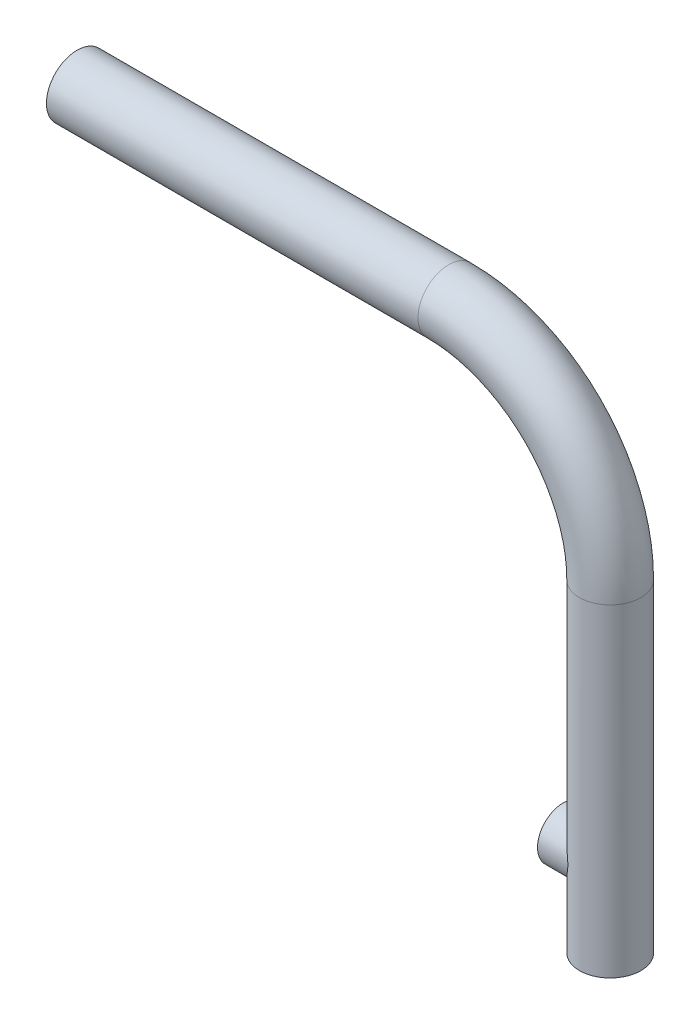
ISO-10303-21;
HEADER;
FILE_DESCRIPTION(('STEP AP214'),'2;1');
FILE_NAME('part.step','',(''),(''),'','','');
FILE_SCHEMA(('AUTOMOTIVE_DESIGN { 1 0 10303 214 1 1 1 1 }'));
ENDSEC;
DATA;
#1=APPLICATION_CONTEXT('core data for automotive mechanical design processes');
#2=APPLICATION_PROTOCOL_DEFINITION('international standard','automotive_design',2000,#1);
#3=PRODUCT_CONTEXT('',#1,'mechanical');
#4=PRODUCT('Part','Part','',(#3));
#5=PRODUCT_RELATED_PRODUCT_CATEGORY('part','',(#4));
#6=PRODUCT_DEFINITION_FORMATION('','',#4);
#7=PRODUCT_DEFINITION_CONTEXT('part definition',#1,'design');
#8=PRODUCT_DEFINITION('design','',#6,#7);
#9=PRODUCT_DEFINITION_SHAPE('','',#8);
#10=(LENGTH_UNIT() NAMED_UNIT(*) SI_UNIT(.MILLI.,.METRE.));
#11=(NAMED_UNIT(*) PLANE_ANGLE_UNIT() SI_UNIT($,.RADIAN.));
#12=(NAMED_UNIT(*) SI_UNIT($,.STERADIAN.) SOLID_ANGLE_UNIT());
#13=UNCERTAINTY_MEASURE_WITH_UNIT(LENGTH_MEASURE(1.E-05),#10,'distance_accuracy_value','');
#14=(GEOMETRIC_REPRESENTATION_CONTEXT(3) GLOBAL_UNCERTAINTY_ASSIGNED_CONTEXT((#13)) GLOBAL_UNIT_ASSIGNED_CONTEXT((#10,
#11,#12)) REPRESENTATION_CONTEXT('',''));
#15=CARTESIAN_POINT('',(0.,0.,0.));
#16=DIRECTION('',(0.,0.,1.));
#17=DIRECTION('',(1.,0.,0.));
#18=AXIS2_PLACEMENT_3D('',#15,#16,#17);
#19=CARTESIAN_POINT('',(80.2564105885616,-44.1229147782417,0.));
#20=DIRECTION('',(0.,-1.,0.));
#21=DIRECTION('',(1.,0.,0.));
#22=AXIS2_PLACEMENT_3D('',#19,#20,#21);
#23=CYLINDRICAL_SURFACE('',#22,19.);
#24=CARTESIAN_POINT('',(80.2564105885616,-244.122914778242,0.));
#25=DIRECTION('',(0.,1.,0.));
#26=DIRECTION('',(-1.,0.,0.));
#27=AXIS2_PLACEMENT_3D('',#24,#25,#26);
#28=CIRCLE('',#27,19.);
#29=CARTESIAN_POINT('',(61.2564105885616,-244.122914778242,0.));
#30=VERTEX_POINT('',#29);
#31=EDGE_CURVE('E64',#30,#30,#28,.T.);
#32=ORIENTED_EDGE('',*,*,#31,.T.);
#33=EDGE_LOOP('',(#32));
#34=FACE_BOUND('',#33,.T.);
#35=CARTESIAN_POINT('',(80.2564105885616,-44.1229147782417,0.));
#36=DIRECTION('',(0.,1.,0.));
#37=DIRECTION('',(-1.,0.,0.));
#38=AXIS2_PLACEMENT_3D('',#35,#36,#37);
#39=CIRCLE('',#38,19.);
#40=CARTESIAN_POINT('',(99.2564105885616,-44.1229147782417,0.));
#41=VERTEX_POINT('',#40);
#42=EDGE_CURVE('E69',#41,#41,#39,.T.);
#43=ORIENTED_EDGE('',*,*,#42,.F.);
#44=EDGE_LOOP('',(#43));
#45=FACE_BOUND('',#44,.T.);
#46=CARTESIAN_POINT('',(70.009459822602,-194.066559594014,-16.));
#47=CARTESIAN_POINT('',(70.0094526559944,-194.344324391861,-15.9999974132716));
#48=CARTESIAN_POINT('',(69.9981066117281,-194.622143252007,-15.9927465313038));
#49=CARTESIAN_POINT('',(69.9533396166383,-195.175349666771,-15.9639407215576));
#50=CARTESIAN_POINT('',(69.9199058030936,-195.450735709895,-15.9423774589891));
#51=CARTESIAN_POINT('',(69.832620377209,-195.99747759059,-15.8854429431641));
#52=CARTESIAN_POINT('',(69.7787176752074,-196.268821563585,-15.8500371327769));
#53=CARTESIAN_POINT('',(69.6529849059693,-196.805305746474,-15.7661998158233));
#54=CARTESIAN_POINT('',(69.5811476577037,-197.07044342473,-15.7177630910479));
#55=CARTESIAN_POINT('',(69.3906608513179,-197.697818231283,-15.5869684987352));
#56=CARTESIAN_POINT('',(69.2647648269802,-198.056641502405,-15.4987850613773));
#57=CARTESIAN_POINT('',(68.9906199837817,-198.75941922518,-15.300671531122));
#58=CARTESIAN_POINT('',(68.842359365878,-199.103365704194,-15.1907299495218));
#59=CARTESIAN_POINT('',(68.5293100555573,-199.777446504139,-14.9503897322486));
#60=CARTESIAN_POINT('',(68.3644766166108,-200.107539824882,-14.8199351460287));
#61=CARTESIAN_POINT('',(68.0236970562892,-200.753447102317,-14.5399249153233));
#62=CARTESIAN_POINT('',(67.8477515267534,-201.069261817965,-14.3903702876888));
#63=CARTESIAN_POINT('',(67.4041218832953,-201.83307569172,-13.9979573477446));
#64=CARTESIAN_POINT('',(67.1322999131043,-202.273185780088,-13.7443554862661));
#65=CARTESIAN_POINT('',(66.5832892170915,-203.125264134734,-13.1983309956678));
#66=CARTESIAN_POINT('',(66.3060981213371,-203.537219592702,-12.9058908736837));
#67=CARTESIAN_POINT('',(65.7545058367255,-204.332380156573,-12.2828235712926));
#68=CARTESIAN_POINT('',(65.4801022134147,-204.715612626916,-11.9522335192349));
#69=CARTESIAN_POINT('',(64.9406543285844,-205.452305268418,-11.2526721267967));
#70=CARTESIAN_POINT('',(64.6756064271122,-205.80577709413,-10.8837159386695));
#71=CARTESIAN_POINT('',(64.2167313006028,-206.407567518139,-10.191271750749));
#72=CARTESIAN_POINT('',(64.0198858387309,-206.662108341304,-9.87517494273733));
#73=CARTESIAN_POINT('',(63.6388310518982,-207.149643373913,-9.21953195567225));
#74=CARTESIAN_POINT('',(63.4546212653549,-207.382638370535,-8.87998663410557));
#75=CARTESIAN_POINT('',(63.1021999632342,-207.824636992283,-8.17844435309756));
#76=CARTESIAN_POINT('',(62.9339675856759,-208.033671978349,-7.8164777196354));
#77=CARTESIAN_POINT('',(62.6164278761091,-208.42560494244,-7.07072443978614));
#78=CARTESIAN_POINT('',(62.4671170308675,-208.608507773327,-6.68694186327398));
#79=CARTESIAN_POINT('',(62.2149285324614,-208.915847763382,-5.96852668943652));
#80=CARTESIAN_POINT('',(62.1085023792318,-209.044910547347,-5.63711326826689));
#81=CARTESIAN_POINT('',(61.9124223486733,-209.281891861819,-4.96201375062467));
#82=CARTESIAN_POINT('',(61.8227652371479,-209.389814469762,-4.61833003594706));
#83=CARTESIAN_POINT('',(61.6618576400204,-209.583010770158,-3.92055342288623));
#84=CARTESIAN_POINT('',(61.5906006463245,-209.668292470966,-3.56646425438804));
#85=CARTESIAN_POINT('',(61.4678562412792,-209.814936833805,-2.84996743837542));
#86=CARTESIAN_POINT('',(61.4163690551863,-209.876299223299,-2.48755969612929));
#87=CARTESIAN_POINT('',(61.3340735946626,-209.974279384822,-1.75540748526202));
#88=CARTESIAN_POINT('',(61.3033584695978,-210.010785698193,-1.38563752366775));
#89=CARTESIAN_POINT('',(61.2636659628452,-210.057948257497,-0.643280762374963));
#90=CARTESIAN_POINT('',(61.2546886265538,-210.068604449447,-0.270693956795509));
#91=CARTESIAN_POINT('',(61.2586773716293,-210.063867761667,0.474178855467361));
#92=CARTESIAN_POINT('',(61.2716425909903,-210.048475905227,0.846464873392307));
#93=CARTESIAN_POINT('',(61.3192189015208,-209.991931264095,1.58766200894079));
#94=CARTESIAN_POINT('',(61.3538291778484,-209.950779449153,1.95657325307938));
#95=CARTESIAN_POINT('',(61.4407242001684,-209.847268776043,2.66218729119098));
#96=CARTESIAN_POINT('',(61.4915828320492,-209.786619179965,2.99932009383728));
#97=CARTESIAN_POINT('',(61.6103811806391,-209.644618701966,3.66609558882488));
#98=CARTESIAN_POINT('',(61.6783199029461,-209.5632690252,3.99573871599689));
#99=CARTESIAN_POINT('',(61.8301228440137,-209.380952431585,4.64578759618012));
#100=CARTESIAN_POINT('',(61.913987615864,-209.279984833431,4.96619302793375));
#101=CARTESIAN_POINT('',(62.096324828296,-209.059642656615,5.59632827158694));
#102=CARTESIAN_POINT('',(62.1947981806717,-208.940266928992,5.90605741563841));
#103=CARTESIAN_POINT('',(62.4135860113287,-208.673839894684,6.53870466215178));
#104=CARTESIAN_POINT('',(62.5350307061248,-208.525319909599,6.86061247174463));
#105=CARTESIAN_POINT('',(62.7915312750707,-208.209771871296,7.48955002903106));
#106=CARTESIAN_POINT('',(62.9265875346631,-208.042743293951,7.79657935504148));
#107=CARTESIAN_POINT('',(63.2085564121969,-207.691547819866,8.39524908960755));
#108=CARTESIAN_POINT('',(63.3554760731088,-207.507370732454,8.68688018422615));
#109=CARTESIAN_POINT('',(63.6593018145617,-207.123274834789,9.25416481867157));
#110=CARTESIAN_POINT('',(63.8162098704018,-206.923352908981,9.5298151774344));
#111=CARTESIAN_POINT('',(64.2166582636147,-206.408009457074,10.1951868281285));
#112=CARTESIAN_POINT('',(64.4651847491201,-206.083742996398,10.5751081651732));
#113=CARTESIAN_POINT('',(64.9746961210211,-205.405908883411,11.2989033730554));
#114=CARTESIAN_POINT('',(65.2356866853815,-205.052327821905,11.642760582594));
#115=CARTESIAN_POINT('',(65.764665292189,-204.317218530551,12.2949536390451));
#116=CARTESIAN_POINT('',(66.0326651276411,-203.935640951345,12.6032241714526));
#117=CARTESIAN_POINT('',(66.5687206229712,-203.14604618607,13.183434640534));
#118=CARTESIAN_POINT('',(66.8367762326857,-202.738038056249,13.4553869246455));
#119=CARTESIAN_POINT('',(67.2996652754574,-201.999904385659,13.899590876647));
#120=CARTESIAN_POINT('',(67.4961521959707,-201.6755979274,14.0798308691496));
#121=CARTESIAN_POINT('',(67.8808359576272,-201.011218446468,14.4191146943914));
#122=CARTESIAN_POINT('',(68.0690320259053,-200.671143959953,14.578156553849));
#123=CARTESIAN_POINT('',(68.4316070427296,-199.975363656054,14.8737552808811));
#124=CARTESIAN_POINT('',(68.6060177311384,-199.619696862292,15.0103646292503));
#125=CARTESIAN_POINT('',(68.9350490342606,-198.891355683295,15.26005821871));
#126=CARTESIAN_POINT('',(69.089680229632,-198.518690536966,15.3731550577817));
#127=CARTESIAN_POINT('',(69.321705587485,-197.890237331243,15.5384959915012));
#128=CARTESIAN_POINT('',(69.4071535193275,-197.639364519259,15.5981623733734));
#129=CARTESIAN_POINT('',(69.5638304968046,-197.13082844317,15.7059787542427));
#130=CARTESIAN_POINT('',(69.6350645642333,-196.87316761384,15.754132821765));
#131=CARTESIAN_POINT('',(69.7606557142116,-196.352293942971,15.8380821933515));
#132=CARTESIAN_POINT('',(69.8150461102697,-196.089093174422,15.8739019082876));
#133=CARTESIAN_POINT('',(69.9047950505877,-195.558000677199,15.9325751375315));
#134=CARTESIAN_POINT('',(69.9401542796204,-195.290109117665,15.9554291183694));
#135=CARTESIAN_POINT('',(69.9903020744348,-194.749248842477,15.9877432145455));
#136=CARTESIAN_POINT('',(70.0049119779773,-194.476256296058,15.9970870126134));
#137=CARTESIAN_POINT('',(70.0121893984186,-193.929864998533,16.0017484326013));
#138=CARTESIAN_POINT('',(70.0048576915314,-193.656466262139,15.9970665506987));
#139=CARTESIAN_POINT('',(69.968639530436,-193.11143182339,15.9737978642688));
#140=CARTESIAN_POINT('',(69.939730639598,-192.83979825329,15.9551965858664));
#141=CARTESIAN_POINT('',(69.8618439697079,-192.300707633455,15.9045627610877));
#142=CARTESIAN_POINT('',(69.812862878019,-192.033251280679,15.8725279976816));
#143=CARTESIAN_POINT('',(69.6839988962992,-191.444339197193,15.7870628562369));
#144=CARTESIAN_POINT('',(69.5996351175079,-191.124331368014,15.7304341918573));
#145=CARTESIAN_POINT('',(69.4089209357642,-190.494693975531,15.5995288061324));
#146=CARTESIAN_POINT('',(69.3025636615142,-190.185067690891,15.5252465683004));
#147=CARTESIAN_POINT('',(69.0722489050903,-189.57598925959,15.3601638187153));
#148=CARTESIAN_POINT('',(68.9482424767407,-189.276568378064,15.2693171652119));
#149=CARTESIAN_POINT('',(68.6870120271868,-188.688804900612,15.0723529128142));
#150=CARTESIAN_POINT('',(68.5497874519644,-188.400462769746,14.9662346737429));
#151=CARTESIAN_POINT('',(68.1790511174416,-187.66201409987,14.6704694093156));
#152=CARTESIAN_POINT('',(67.9378073559835,-187.220368156043,14.4693189204878));
#153=CARTESIAN_POINT('',(67.4414904295106,-186.363043205597,14.0316635576138));
#154=CARTESIAN_POINT('',(67.186409557972,-185.947378952569,13.7951388504856));
#155=CARTESIAN_POINT('',(66.6705374062404,-185.140634488356,13.2874084859563));
#156=CARTESIAN_POINT('',(66.4097393541105,-184.749585820882,13.0161596285378));
#157=CARTESIAN_POINT('',(65.8895144786231,-183.992675152031,12.4395787757339));
#158=CARTESIAN_POINT('',(65.6300873840334,-183.626807982238,12.1342538082821));
#159=CARTESIAN_POINT('',(65.1096667887173,-182.90919144038,11.4785535846209));
#160=CARTESIAN_POINT('',(64.8489149099035,-182.558332816372,11.1270072249177));
#161=CARTESIAN_POINT('',(64.3408373749021,-181.886505623853,10.3872986022929));
#162=CARTESIAN_POINT('',(64.0935142621657,-181.565542709505,9.99912944074695));
#163=CARTESIAN_POINT('',(63.6187924467247,-180.957544268041,9.18748707196169));
#164=CARTESIAN_POINT('',(63.3913412994135,-180.670418694459,8.76411292469729));
#165=CARTESIAN_POINT('',(63.0692030935064,-180.267772057135,8.1030872161576));
#166=CARTESIAN_POINT('',(62.9650122496828,-180.138249008801,7.87845672812986));
#167=CARTESIAN_POINT('',(62.7636538975671,-179.88904442821,7.4206464760882));
#168=CARTESIAN_POINT('',(62.6664879980322,-179.769365149382,7.18746477210308));
#169=CARTESIAN_POINT('',(62.4473482192124,-179.500478454274,6.6299082466765));
#170=CARTESIAN_POINT('',(62.3285848087609,-179.355584897766,6.30216465690627));
#171=CARTESIAN_POINT('',(62.1072262672875,-179.086615513067,5.63304971821279));
#172=CARTESIAN_POINT('',(62.0046267440221,-178.962534028979,5.29168210308107));
#173=CARTESIAN_POINT('',(61.8173973231338,-178.736811279047,4.5969683362017));
#174=CARTESIAN_POINT('',(61.7327585302797,-178.635158903966,4.24362821498651));
#175=CARTESIAN_POINT('',(61.5830221753146,-178.455733884517,3.52684024959074));
#176=CARTESIAN_POINT('',(61.5179251985831,-178.377961955492,3.16339210297826));
#177=CARTESIAN_POINT('',(61.4083360591832,-178.247229870777,2.42682412778136));
#178=CARTESIAN_POINT('',(61.3639614594914,-178.194411261956,2.0536615001948));
#179=CARTESIAN_POINT('',(61.2973639382246,-178.115198805636,1.30256662997782));
#180=CARTESIAN_POINT('',(61.2751409533951,-178.08880488268,0.924634400970232));
#181=CARTESIAN_POINT('',(61.253370442362,-178.062948018694,0.16724949974826));
#182=CARTESIAN_POINT('',(61.2538196313038,-178.063481176337,-0.212202944244198));
#183=CARTESIAN_POINT('',(61.2773765433796,-178.091460486605,-0.969390122756827));
#184=CARTESIAN_POINT('',(61.300483024361,-178.118905163845,-1.34712495030226));
#185=CARTESIAN_POINT('',(61.3659044873758,-178.196725971376,-2.06586036144871));
#186=CARTESIAN_POINT('',(61.4064252983877,-178.244961195803,-2.40726072967014));
#187=CARTESIAN_POINT('',(61.5052098526489,-178.362784234435,-3.08371454189126));
#188=CARTESIAN_POINT('',(61.5634723818538,-178.432370587611,-3.41876841850782));
#189=CARTESIAN_POINT('',(61.6967041652384,-178.59191493645,-4.08059609367622));
#190=CARTESIAN_POINT('',(61.7716744310161,-178.68187416563,-4.40736938953163));
#191=CARTESIAN_POINT('',(61.937077513629,-178.881006029729,-5.05098606655071));
#192=CARTESIAN_POINT('',(62.0275112368344,-178.990179790894,-5.36782886436258));
#193=CARTESIAN_POINT('',(62.2281500743601,-179.233381443092,-6.00840600876526));
#194=CARTESIAN_POINT('',(62.3392004213443,-179.368487174667,-6.33146543103493));
#195=CARTESIAN_POINT('',(62.5753595568589,-179.657309903853,-6.96378934704844));
#196=CARTESIAN_POINT('',(62.7004685061914,-179.811027114343,-7.27305368294784));
#197=CARTESIAN_POINT('',(62.96305952962,-180.135690521872,-7.87708716093582));
#198=CARTESIAN_POINT('',(63.1005464239351,-180.306643433969,-8.17185058637751));
#199=CARTESIAN_POINT('',(63.3861388630252,-180.66440801959,-8.74624849132592));
#200=CARTESIAN_POINT('',(63.5342465404627,-180.851222879599,-9.02587991242202));
#201=CARTESIAN_POINT('',(63.9130139086972,-181.333202285734,-9.70087253765006));
#202=CARTESIAN_POINT('',(64.1490324014537,-181.637163238873,-10.0869934565013));
#203=CARTESIAN_POINT('',(64.635331492718,-182.2741682034,-10.8248452610186));
#204=CARTESIAN_POINT('',(64.885618258326,-182.607224824279,-11.1765610948235));
#205=CARTESIAN_POINT('',(65.3955968644828,-183.300908308056,-11.8462535924907));
#206=CARTESIAN_POINT('',(65.6553091669035,-183.661597307307,-12.1641501345621));
#207=CARTESIAN_POINT('',(66.1778251366172,-184.408510166374,-12.7652614297872));
#208=CARTESIAN_POINT('',(66.4406280004112,-184.794727504806,-13.0484849880606));
#209=CARTESIAN_POINT('',(66.9229806648369,-185.531598398463,-13.5395477866699));
#210=CARTESIAN_POINT('',(67.1430080878358,-185.878678627414,-13.7522944256941));
#211=CARTESIAN_POINT('',(67.5759160849928,-186.591582498684,-14.1524520769283));
#212=CARTESIAN_POINT('',(67.7887952898157,-186.957409698706,-14.3398582554176));
#213=CARTESIAN_POINT('',(68.2008773930173,-187.707791581296,-14.6879764647517));
#214=CARTESIAN_POINT('',(68.4001111145236,-188.092300460656,-14.8487499056673));
#215=CARTESIAN_POINT('',(68.7775104511548,-188.881448644908,-15.1423897714508));
#216=CARTESIAN_POINT('',(68.9556909462543,-189.28607344143,-15.275275958621));
#217=CARTESIAN_POINT('',(69.3183680094555,-190.211663729366,-15.5377014507424));
#218=CARTESIAN_POINT('',(69.4950358459204,-190.738115186038,-15.6595643681203));
#219=CARTESIAN_POINT('',(69.7075628001048,-191.547470847185,-15.8028204960244));
#220=CARTESIAN_POINT('',(69.7696110317306,-191.820156419065,-15.8439539939879));
#221=CARTESIAN_POINT('',(69.8736360976062,-192.370993583623,-15.9123190736983));
#222=CARTESIAN_POINT('',(69.915625965467,-192.64914150427,-15.9395596836072));
#223=CARTESIAN_POINT('',(69.9673129429056,-193.117501645506,-15.972947679856));
#224=CARTESIAN_POINT('',(69.9830768624681,-193.306784453255,-15.9830777127936));
#225=CARTESIAN_POINT('',(70.0041540612251,-193.686222786583,-15.9966055993842));
#226=CARTESIAN_POINT('',(70.0094647294626,-193.876378518312,-16.0000017710912));
#227=CARTESIAN_POINT('',(70.009459822602,-194.066559594014,-16.));
#228=B_SPLINE_CURVE_WITH_KNOTS('',3,(#46,#47,#48,#49,#50,#51,#52,#53,#54,#55,#56,#57,#58,#59,
#60,#61,#62,#63,#64,#65,#66,#67,#68,#69,#70,#71,#72,#73,#74,#75,#76,#77,#78,#79,#80,#81,#82,#83,
#84,#85,#86,#87,#88,#89,#90,#91,#92,#93,#94,#95,#96,#97,#98,#99,#100,#101,#102,#103,#104,#105,
#106,#107,#108,#109,#110,#111,#112,#113,#114,#115,#116,#117,#118,#119,#120,#121,#122,#123,#124,
#125,#126,#127,#128,#129,#130,#131,#132,#133,#134,#135,#136,#137,#138,#139,#140,#141,#142,#143,
#144,#145,#146,#147,#148,#149,#150,#151,#152,#153,#154,#155,#156,#157,#158,#159,#160,#161,#162,
#163,#164,#165,#166,#167,#168,#169,#170,#171,#172,#173,#174,#175,#176,#177,#178,#179,#180,#181,
#182,#183,#184,#185,#186,#187,#188,#189,#190,#191,#192,#193,#194,#195,#196,#197,#198,#199,#200,
#201,#202,#203,#204,#205,#206,#207,#208,#209,#210,#211,#212,#213,#214,#215,#216,#217,#218,#219,
#220,#221,#222,#223,#224,#225,#226,#227),.UNSPECIFIED.,.T.,.F.,(4,2,2,2,2,2,2,2,2,2,2,2,2,2,2,2,
2,2,2,2,2,2,2,2,2,2,2,2,2,2,2,2,2,2,2,2,2,2,2,2,2,2,2,2,2,2,2,2,2,2,2,2,2,2,2,2,2,2,2,2,2,2,2,2,
2,2,2,2,2,2,2,2,2,2,2,2,2,2,2,2,2,2,2,2,2,2,2,2,2,2,4),(0.,0.833071065925681,1.66662769549526,
2.50227867719614,3.33826479339819,4.50741719893909,5.67718859362159,6.85020780380853,
8.02316459061828,9.7492027538413,11.476020982959,13.2011725869337,14.925645431837,
16.2776578688644,17.6296208904181,18.9797936352633,20.3297153199358,21.4423412875177,
22.5547524443719,23.6667696024863,24.7787994305107,25.8957835064536,27.0127699150576,
28.1297124442395,29.2466129279474,30.2843738915467,31.3220744507378,32.3598110544216,
33.3976124556591,34.5207660872612,35.6439515324767,36.7678087544714,37.8918889244424,
39.5632270522933,41.2353339531253,42.910462561412,44.5850202035725,45.8437523071172,
47.1026015012049,48.3584623168349,49.6136484992452,50.4280356076499,51.2421344795964,
52.0546127844215,52.8670618529806,53.6864649662311,54.505839092339,55.326066418321,
56.1464291659408,57.1520854250092,58.1580563512892,59.166873547509,60.1757330451562,
61.799171668836,63.4235239336072,65.0499170457846,66.6759753446919,68.3568094376246,
70.0379607832516,71.7145321572496,72.5525439922034,73.3907471332985,74.522135806753,
75.6532165135848,76.7837357272089,77.9142888024106,79.0511801063487,80.188068163858,
81.3247915039796,82.4614525284015,83.5017674334894,84.5420111670812,85.5823179010951,
86.6226856322193,87.7236994553922,88.824725873221,89.9261829227864,91.02786176858,
92.6609573908163,94.2947643094328,95.9323595279928,97.5695380167735,98.9567516591856,
100.344229541956,101.728462235203,103.111710654573,104.810455273359,105.657555103267,
106.504103749693,107.074351652595,107.644741970886),.UNSPECIFIED.);
#229=CARTESIAN_POINT('',(70.009459822602,-194.066559594014,-16.));
#230=VERTEX_POINT('',#229);
#231=EDGE_CURVE('E11',#230,#230,#228,.T.);
#232=ORIENTED_EDGE('',*,*,#231,.F.);
#233=EDGE_LOOP('',(#232));
#234=FACE_BOUND('',#233,.T.);
#235=ADVANCED_FACE('F51',(#34,#45,#234),#23,.T.);
#236=CARTESIAN_POINT('',(-249.743589411438,55.8770852217582,0.));
#237=DIRECTION('',(-1.,0.,0.));
#238=DIRECTION('',(0.,-1.,0.));
#239=AXIS2_PLACEMENT_3D('',#236,#237,#238);
#240=PLANE('',#239);
#241=CARTESIAN_POINT('',(-249.743589411438,55.8770852217582,0.));
#242=DIRECTION('',(-1.,0.,0.));
#243=DIRECTION('',(0.,-1.,0.));
#244=AXIS2_PLACEMENT_3D('',#241,#242,#243);
#245=CIRCLE('',#244,15.);
#246=CARTESIAN_POINT('',(-249.743589411438,40.8770852217582,0.));
#247=VERTEX_POINT('',#246);
#248=EDGE_CURVE('E96',#247,#247,#245,.T.);
#249=ORIENTED_EDGE('',*,*,#248,.F.);
#250=EDGE_LOOP('',(#249));
#251=FACE_BOUND('',#250,.T.);
#252=CARTESIAN_POINT('',(-249.743589411438,55.8770852217582,0.));
#253=DIRECTION('',(-1.,0.,0.));
#254=DIRECTION('',(0.,-1.,0.));
#255=AXIS2_PLACEMENT_3D('',#252,#253,#254);
#256=CIRCLE('',#255,19.);
#257=CARTESIAN_POINT('',(-249.743589411438,36.8770852217582,0.));
#258=VERTEX_POINT('',#257);
#259=EDGE_CURVE('E77',#258,#258,#256,.T.);
#260=ORIENTED_EDGE('',*,*,#259,.T.);
#261=EDGE_LOOP('',(#260));
#262=FACE_BOUND('',#261,.T.);
#263=ADVANCED_FACE('F144',(#251,#262),#240,.T.);
#264=CARTESIAN_POINT('',(80.2564105885616,-244.122914778242,0.));
#265=DIRECTION('',(0.,1.,0.));
#266=DIRECTION('',(-1.,0.,0.));
#267=AXIS2_PLACEMENT_3D('',#264,#265,#266);
#268=PLANE('',#267);
#269=CARTESIAN_POINT('',(80.2564105885616,-244.122914778242,0.));
#270=DIRECTION('',(0.,1.,0.));
#271=DIRECTION('',(-1.,0.,0.));
#272=AXIS2_PLACEMENT_3D('',#269,#270,#271);
#273=CIRCLE('',#272,15.);
#274=CARTESIAN_POINT('',(65.2564105885616,-244.122914778242,0.));
#275=VERTEX_POINT('',#274);
#276=EDGE_CURVE('E80',#275,#275,#273,.T.);
#277=ORIENTED_EDGE('',*,*,#276,.T.);
#278=EDGE_LOOP('',(#277));
#279=FACE_BOUND('',#278,.T.);
#280=ORIENTED_EDGE('',*,*,#31,.F.);
#281=EDGE_LOOP('',(#280));
#282=FACE_BOUND('',#281,.T.);
#283=ADVANCED_FACE('F145',(#279,#282),#268,.F.);
#284=CARTESIAN_POINT('',(-249.743589411438,55.8770852217582,0.));
#285=DIRECTION('',(1.,0.,0.));
#286=DIRECTION('',(0.,0.,-1.));
#287=AXIS2_PLACEMENT_3D('',#284,#285,#286);
#288=CYLINDRICAL_SURFACE('',#287,19.);
#289=CARTESIAN_POINT('',(-19.7435894114386,55.8770852217582,0.));
#290=DIRECTION('',(1.,0.,0.));
#291=DIRECTION('',(0.,0.,-1.));
#292=AXIS2_PLACEMENT_3D('',#289,#290,#291);
#293=CIRCLE('',#292,19.);
#294=CARTESIAN_POINT('',(-19.7435894114386,74.8770852217582,0.));
#295=VERTEX_POINT('',#294);
#296=EDGE_CURVE('E74',#295,#295,#293,.F.);
#297=ORIENTED_EDGE('',*,*,#296,.T.);
#298=EDGE_LOOP('',(#297));
#299=FACE_BOUND('',#298,.T.);
#300=ORIENTED_EDGE('',*,*,#259,.F.);
#301=EDGE_LOOP('',(#300));
#302=FACE_BOUND('',#301,.T.);
#303=ADVANCED_FACE('F148',(#299,#302),#288,.T.);
#304=CARTESIAN_POINT('',(-19.7435894114384,-44.1229147782417,0.));
#305=DIRECTION('',(0.,0.,-1.));
#306=DIRECTION('',(-1.,0.,0.));
#307=AXIS2_PLACEMENT_3D('',#304,#305,#306);
#308=TOROIDAL_SURFACE('',#307,100.,19.);
#309=CARTESIAN_POINT('',(-19.7435894114384,-44.1229147782417,0.));
#310=DIRECTION('',(0.,0.,-1.));
#311=DIRECTION('',(-1.,0.,0.));
#312=AXIS2_PLACEMENT_3D('',#309,#310,#311);
#313=CIRCLE('',#312,119.);
#314=EDGE_CURVE('',#295,#41,#313,.T.);
#315=ORIENTED_EDGE('',*,*,#296,.F.);
#316=ORIENTED_EDGE('',*,*,#42,.T.);
#317=ORIENTED_EDGE('',*,*,#314,.T.);
#318=ORIENTED_EDGE('',*,*,#314,.F.);
#319=EDGE_LOOP('',(#315,#317,#316,#318));
#320=FACE_BOUND('',#319,.T.);
#321=ADVANCED_FACE('F136',(#320),#308,.T.);
#322=CARTESIAN_POINT('',(-249.743589411438,55.8770852217582,0.));
#323=DIRECTION('',(1.,0.,0.));
#324=DIRECTION('',(0.,0.,-1.));
#325=AXIS2_PLACEMENT_3D('',#322,#323,#324);
#326=CYLINDRICAL_SURFACE('',#325,15.);
#327=CARTESIAN_POINT('',(-19.7435894114386,55.8770852217582,0.));
#328=DIRECTION('',(-1.,0.,0.));
#329=DIRECTION('',(0.,-1.,0.));
#330=AXIS2_PLACEMENT_3D('',#327,#328,#329);
#331=CIRCLE('',#330,15.);
#332=CARTESIAN_POINT('',(-19.7435894114386,70.8770852217582,0.));
#333=VERTEX_POINT('',#332);
#334=EDGE_CURVE('E92',#333,#333,#331,.T.);
#335=ORIENTED_EDGE('',*,*,#334,.F.);
#336=EDGE_LOOP('',(#335));
#337=FACE_BOUND('',#336,.T.);
#338=ORIENTED_EDGE('',*,*,#248,.T.);
#339=EDGE_LOOP('',(#338));
#340=FACE_BOUND('',#339,.T.);
#341=ADVANCED_FACE('F132',(#337,#340),#326,.F.);
#342=CARTESIAN_POINT('',(-19.7435894114384,-44.1229147782417,0.));
#343=DIRECTION('',(0.,0.,-1.));
#344=DIRECTION('',(-1.,0.,0.));
#345=AXIS2_PLACEMENT_3D('',#342,#343,#344);
#346=TOROIDAL_SURFACE('',#345,100.,15.);
#347=CARTESIAN_POINT('',(80.2564105885616,-44.1229147782418,0.));
#348=DIRECTION('',(0.,1.,0.));
#349=DIRECTION('',(-1.,0.,0.));
#350=AXIS2_PLACEMENT_3D('',#347,#348,#349);
#351=CIRCLE('',#350,15.);
#352=CARTESIAN_POINT('',(95.2564105885616,-44.1229147782418,0.));
#353=VERTEX_POINT('',#352);
#354=EDGE_CURVE('E88',#353,#353,#351,.T.);
#355=CARTESIAN_POINT('',(-19.7435894114384,-44.1229147782417,0.));
#356=DIRECTION('',(0.,0.,-1.));
#357=DIRECTION('',(-1.,0.,0.));
#358=AXIS2_PLACEMENT_3D('',#355,#356,#357);
#359=CIRCLE('',#358,115.);
#360=EDGE_CURVE('',#333,#353,#359,.T.);
#361=ORIENTED_EDGE('',*,*,#334,.T.);
#362=ORIENTED_EDGE('',*,*,#354,.F.);
#363=ORIENTED_EDGE('',*,*,#360,.T.);
#364=ORIENTED_EDGE('',*,*,#360,.F.);
#365=EDGE_LOOP('',(#361,#363,#362,#364));
#366=FACE_BOUND('',#365,.T.);
#367=ADVANCED_FACE('F135',(#366),#346,.F.);
#368=CARTESIAN_POINT('',(80.2564105885616,-44.1229147782417,0.));
#369=DIRECTION('',(0.,-1.,0.));
#370=DIRECTION('',(1.,0.,0.));
#371=AXIS2_PLACEMENT_3D('',#368,#369,#370);
#372=CYLINDRICAL_SURFACE('',#371,15.);
#373=ORIENTED_EDGE('',*,*,#276,.F.);
#374=EDGE_LOOP('',(#373));
#375=FACE_BOUND('',#374,.T.);
#376=ORIENTED_EDGE('',*,*,#354,.T.);
#377=EDGE_LOOP('',(#376));
#378=FACE_BOUND('',#377,.T.);
#379=ADVANCED_FACE('F130',(#375,#378),#372,.F.);
#380=CARTESIAN_POINT('',(51.2564105885616,-194.066559594014,0.));
#381=DIRECTION('',(1.,0.,0.));
#382=DIRECTION('',(0.,0.,-1.));
#383=AXIS2_PLACEMENT_3D('',#380,#381,#382);
#384=CYLINDRICAL_SURFACE('',#383,14.);
#385=CARTESIAN_POINT('',(51.2564105885616,-194.066559594014,0.));
#386=DIRECTION('',(-1.,0.,0.));
#387=DIRECTION('',(0.,0.,1.));
#388=AXIS2_PLACEMENT_3D('',#385,#386,#387);
#389=CIRCLE('',#388,14.);
#390=CARTESIAN_POINT('',(51.2564105885616,-194.066559594014,14.));
#391=VERTEX_POINT('',#390);
#392=EDGE_CURVE('E104',#391,#391,#389,.T.);
#393=ORIENTED_EDGE('',*,*,#392,.T.);
#394=EDGE_LOOP('',(#393));
#395=FACE_BOUND('',#394,.T.);
#396=CARTESIAN_POINT('',(67.4111780098965,-194.066559594014,14.));
#397=CARTESIAN_POINT('',(67.4111854481021,-193.737304137991,14.0000036110362));
#398=CARTESIAN_POINT('',(67.3984565254645,-193.40808390171,13.9883588077584));
#399=CARTESIAN_POINT('',(67.3483243319154,-192.753022666362,13.9421114038126));
#400=CARTESIAN_POINT('',(67.3109096854751,-192.427183295591,13.907498218949));
#401=CARTESIAN_POINT('',(67.2134160834233,-191.78141114635,13.816103751955));
#402=CARTESIAN_POINT('',(67.1532883796487,-191.461492635895,13.7592747797161));
#403=CARTESIAN_POINT('',(67.0133641302052,-190.830342149087,13.6246511005455));
#404=CARTESIAN_POINT('',(66.9335548590026,-190.519115938439,13.5468428259516));
#405=CARTESIAN_POINT('',(66.7588741195958,-189.91118221211,13.3727887805541));
#406=CARTESIAN_POINT('',(66.6642215508959,-189.614335055808,13.2768073067757));
#407=CARTESIAN_POINT('',(66.4623571766429,-189.031620410542,13.0669533306122));
#408=CARTESIAN_POINT('',(66.3551497439323,-188.745749144482,12.9530870527936));
#409=CARTESIAN_POINT('',(66.1311463785813,-188.185311900773,12.7084384935418));
#410=CARTESIAN_POINT('',(66.0143515698262,-187.91074460366,12.5776581938322));
#411=CARTESIAN_POINT('',(65.773833552881,-187.373066569716,12.2999478715868));
#412=CARTESIAN_POINT('',(65.6501098612109,-187.109956634634,12.1530167213945));
#413=CARTESIAN_POINT('',(65.3729379081633,-186.543909873609,11.8126846762406));
#414=CARTESIAN_POINT('',(65.2184885798274,-186.243515175081,11.6158639080711));
#415=CARTESIAN_POINT('',(64.9066668602348,-185.659686300978,11.200572515398));
#416=CARTESIAN_POINT('',(64.7492942335419,-185.376253499307,10.9821001409237));
#417=CARTESIAN_POINT('',(64.4346324590106,-184.826454938273,10.5237216406977));
#418=CARTESIAN_POINT('',(64.2773437014561,-184.560112410681,10.2837873579603));
#419=CARTESIAN_POINT('',(63.9660147089305,-184.045635544928,9.78314496246692));
#420=CARTESIAN_POINT('',(63.8119747319329,-183.797502648877,9.52243520780365));
#421=CARTESIAN_POINT('',(63.4806234303604,-183.27417046793,8.92804956097763));
#422=CARTESIAN_POINT('',(63.3045952833682,-183.003059735747,8.59003059660378));
#423=CARTESIAN_POINT('',(62.9657504353794,-182.490555802713,7.88579637783006));
#424=CARTESIAN_POINT('',(62.8029365582255,-182.249168948079,7.51957512911663));
#425=CARTESIAN_POINT('',(62.4953799192038,-181.799487585042,6.76113421349756));
#426=CARTESIAN_POINT('',(62.3506046787987,-181.591133411466,6.36896327761873));
#427=CARTESIAN_POINT('',(62.0832740409125,-181.210383205166,5.56040851596713));
#428=CARTESIAN_POINT('',(61.9607074785507,-181.037969097842,5.14403699629143));
#429=CARTESIAN_POINT('',(61.7740044630975,-180.777279199751,4.41563002412012));
#430=CARTESIAN_POINT('',(61.7032702287618,-180.679152491159,4.10876943235665));
#431=CARTESIAN_POINT('',(61.5762903416995,-180.503721885412,3.48624897670375));
#432=CARTESIAN_POINT('',(61.5200413384237,-180.426413172701,3.17059116643561));
#433=CARTESIAN_POINT('',(61.4231898017938,-180.293678172446,2.53255748518262));
#434=CARTESIAN_POINT('',(61.3825769660026,-180.2382374758,2.21018618574166));
#435=CARTESIAN_POINT('',(61.317806878592,-180.149964753864,1.56070004601407));
#436=CARTESIAN_POINT('',(61.2936502087765,-180.117133527925,1.23358503843232));
#437=CARTESIAN_POINT('',(61.2622935700926,-180.074537203876,0.576237824020255));
#438=CARTESIAN_POINT('',(61.2551350672847,-180.064828511698,0.245999963380244));
#439=CARTESIAN_POINT('',(61.2580586168318,-180.06879622362,-0.414256888148521));
#440=CARTESIAN_POINT('',(61.2681406021858,-180.08247253684,-0.744275879882871));
#441=CARTESIAN_POINT('',(61.3053198843639,-180.132998297638,-1.40162962442476));
#442=CARTESIAN_POINT('',(61.332420746699,-180.169852601084,-1.72896380019294));
#443=CARTESIAN_POINT('',(61.4030404127093,-180.266174141923,-2.37847702008329));
#444=CARTESIAN_POINT('',(61.4465591418806,-180.3256412767,-2.70065608759229));
#445=CARTESIAN_POINT('',(61.5474829080127,-180.464127901674,-3.32771957585502));
#446=CARTESIAN_POINT('',(61.6044109766168,-180.542477575283,-3.63282973660964));
#447=CARTESIAN_POINT('',(61.7317307571139,-180.718620951157,-4.23447638193975));
#448=CARTESIAN_POINT('',(61.8021220929001,-180.816414110258,-4.53101310575452));
#449=CARTESIAN_POINT('',(61.9551373001267,-181.030371707134,-5.11412442248884));
#450=CARTESIAN_POINT('',(62.0377616896832,-181.146536923049,-5.40069859282143));
#451=CARTESIAN_POINT('',(62.2139055108707,-181.396129207015,-5.96278292889669));
#452=CARTESIAN_POINT('',(62.3074264211622,-181.529558618094,-6.2382915862092));
#453=CARTESIAN_POINT('',(62.5147259941222,-181.828089573808,-6.80690484979));
#454=CARTESIAN_POINT('',(62.6296015178664,-181.995059613317,-7.09862843903743));
#455=CARTESIAN_POINT('',(62.8690598193592,-182.347486036136,-7.66648621372022));
#456=CARTESIAN_POINT('',(62.9936431975159,-182.532943563051,-7.94261943310304));
#457=CARTESIAN_POINT('',(63.2506168858589,-182.921236508314,-8.47888234394334));
#458=CARTESIAN_POINT('',(63.3830128940122,-183.124084660197,-8.73900006513496));
#459=CARTESIAN_POINT('',(63.6535140530742,-183.545990117118,-9.24259398621962));
#460=CARTESIAN_POINT('',(63.7916197557716,-183.765048990395,-9.48606857164713));
#461=CARTESIAN_POINT('',(64.0984400342039,-184.262206388398,-10.0013171614119));
#462=CARTESIAN_POINT('',(64.2679265503843,-184.543549642761,-10.2695090441241));
#463=CARTESIAN_POINT('',(64.6084396672132,-185.12703227626,-10.7812562057621));
#464=CARTESIAN_POINT('',(64.7794665650256,-185.429175746154,-11.0248066150774));
#465=CARTESIAN_POINT('',(65.1191050537752,-186.053649869487,-11.4866954223694));
#466=CARTESIAN_POINT('',(65.2877157384546,-186.375987865817,-11.7050245666668));
#467=CARTESIAN_POINT('',(65.6179299709548,-187.040309683315,-12.1154531965859));
#468=CARTESIAN_POINT('',(65.7795352358986,-187.382288641891,-12.3075591349631));
#469=CARTESIAN_POINT('',(66.0579086578895,-188.011848273687,-12.6268583839491));
#470=CARTESIAN_POINT('',(66.1769731893599,-188.295799906548,-12.7592165145407));
#471=CARTESIAN_POINT('',(66.4045140902406,-188.875594358406,-13.0058875355673));
#472=CARTESIAN_POINT('',(66.5129908004675,-189.171436794211,-13.1202010069237));
#473=CARTESIAN_POINT('',(66.7158693863439,-189.77394449503,-13.3294771138082));
#474=CARTESIAN_POINT('',(66.8102972240427,-190.080588468108,-13.4244755653388));
#475=CARTESIAN_POINT('',(66.9817897753853,-190.70422240858,-13.5940803730691));
#476=CARTESIAN_POINT('',(67.0588584299278,-191.021210009007,-13.6686913584724));
#477=CARTESIAN_POINT('',(67.1803316281308,-191.606747858299,-13.7848435053311));
#478=CARTESIAN_POINT('',(67.2281064686625,-191.873901848423,-13.8299045451927));
#479=CARTESIAN_POINT('',(67.3078833843711,-192.412690901137,-13.9046268978785));
#480=CARTESIAN_POINT('',(67.3398873819365,-192.6843254134,-13.934290087649));
#481=CARTESIAN_POINT('',(67.3868413563576,-193.230108725226,-13.977668580972));
#482=CARTESIAN_POINT('',(67.4018060527273,-193.504255148138,-13.9913976495196));
#483=CARTESIAN_POINT('',(67.4141030755053,-194.053287121251,-14.0026858541532));
#484=CARTESIAN_POINT('',(67.4114350880853,-194.32817268452,-14.0002447024399));
#485=CARTESIAN_POINT('',(67.3885875749573,-194.876397595957,-13.9792476550569));
#486=CARTESIAN_POINT('',(67.3684200138832,-195.14973787216,-13.9607027696647));
#487=CARTESIAN_POINT('',(67.3114251860051,-195.693113370618,-13.9078700712928));
#488=CARTESIAN_POINT('',(67.2745979274837,-195.963148594517,-13.87358226614));
#489=CARTESIAN_POINT('',(67.1856427451388,-196.498590592522,-13.7898059757974));
#490=CARTESIAN_POINT('',(67.1334973515108,-196.763991713436,-13.7403001319497));
#491=CARTESIAN_POINT('',(67.0156792737149,-197.288735072371,-13.6268013942976));
#492=CARTESIAN_POINT('',(66.949998787998,-197.5480737196,-13.5628001433075));
#493=CARTESIAN_POINT('',(66.778957657962,-198.160316658024,-13.393203753962));
#494=CARTESIAN_POINT('',(66.6681487259588,-198.509921694715,-13.2811484085822));
#495=CARTESIAN_POINT('',(66.429348477351,-199.193985788162,-13.0323464451261));
#496=CARTESIAN_POINT('',(66.3013571725126,-199.528444855291,-12.895599843958));
#497=CARTESIAN_POINT('',(66.0327311282469,-200.182281460674,-12.5986939017855));
#498=CARTESIAN_POINT('',(65.8920739534346,-200.501630645658,-12.4384926880123));
#499=CARTESIAN_POINT('',(65.6025519659625,-201.124288696253,-12.0960613941301));
#500=CARTESIAN_POINT('',(65.453687982291,-201.427599175928,-11.9138335367729));
#501=CARTESIAN_POINT('',(65.1464855373762,-202.027613785671,-11.5218993034189));
#502=CARTESIAN_POINT('',(64.9879963965708,-202.323782402273,-11.311492095228));
#503=CARTESIAN_POINT('',(64.6697017008764,-202.89847427882,-10.8687103327021));
#504=CARTESIAN_POINT('',(64.509896093683,-203.176996833812,-10.6363349016682));
#505=CARTESIAN_POINT('',(64.1922791395497,-203.715578514123,-10.1502666643747));
#506=CARTESIAN_POINT('',(64.0344664554948,-203.97565062595,-9.89658913200894));
#507=CARTESIAN_POINT('',(63.7236879496894,-204.476626894543,-9.36819232694733));
#508=CARTESIAN_POINT('',(63.5707219934924,-204.717531583288,-9.09347363864929));
#509=CARTESIAN_POINT('',(63.2745795474788,-205.175686064979,-8.52748383164065));
#510=CARTESIAN_POINT('',(63.1312953941591,-205.393221630698,-8.23650091073462));
#511=CARTESIAN_POINT('',(62.8548819170755,-205.806954947578,-7.6351991671806));
#512=CARTESIAN_POINT('',(62.7217512493152,-206.003155524278,-7.3248829135614));
#513=CARTESIAN_POINT('',(62.4682534607208,-206.372516399941,-6.68577862793984));
#514=CARTESIAN_POINT('',(62.3478872802282,-206.545675001675,-6.35698923777379));
#515=CARTESIAN_POINT('',(62.1225252602909,-206.866985723495,-5.68231222338757));
#516=CARTESIAN_POINT('',(62.0175292423054,-207.015138134058,-5.3364247978417));
#517=CARTESIAN_POINT('',(61.8245136206384,-207.285632514647,-4.62620680199337));
#518=CARTESIAN_POINT('',(61.7366577557951,-207.407726497849,-4.26173668299666));
#519=CARTESIAN_POINT('',(61.5814551598662,-207.622350188291,-3.51988765540235));
#520=CARTESIAN_POINT('',(61.514108762238,-207.714879414848,-3.14250853703214));
#521=CARTESIAN_POINT('',(61.4019271904035,-207.868526824752,-2.37851863006185));
#522=CARTESIAN_POINT('',(61.3570682706182,-207.929678143118,-1.99191803282743));
#523=CARTESIAN_POINT('',(61.291142952263,-208.019420031499,-1.21297089599009));
#524=CARTESIAN_POINT('',(61.2700721939662,-208.048016567934,-0.820625422623867));
#525=CARTESIAN_POINT('',(61.2537273247766,-208.070201807685,-0.0947038181113901));
#526=CARTESIAN_POINT('',(61.2549944568972,-208.068484234816,0.238663372230314));
#527=CARTESIAN_POINT('',(61.2750068180848,-208.041314665377,0.9038742821659));
#528=CARTESIAN_POINT('',(61.2937499226052,-208.015865553841,1.23571818201773));
#529=CARTESIAN_POINT('',(61.3482853753909,-207.941639037803,1.89534823766214));
#530=CARTESIAN_POINT('',(61.384077546203,-207.892861876109,2.22313443565242));
#531=CARTESIAN_POINT('',(61.471919873803,-207.772717708229,2.87231692080877));
#532=CARTESIAN_POINT('',(61.5239704380381,-207.701350135911,3.19371304762034));
#533=CARTESIAN_POINT('',(61.6412332765691,-207.5397850997,3.8173913697203));
#534=CARTESIAN_POINT('',(61.7059457600664,-207.450299181464,4.11995312785449));
#535=CARTESIAN_POINT('',(61.848341210842,-207.252224415996,4.71558586688939));
#536=CARTESIAN_POINT('',(61.9260236844548,-207.143636295826,5.00865720850887));
#537=CARTESIAN_POINT('',(62.0930351044696,-206.908485443719,5.58404342725995));
#538=CARTESIAN_POINT('',(62.1823639611131,-206.781922850312,5.86635838726923));
#539=CARTESIAN_POINT('',(62.3712688445921,-206.511944107419,6.41927434676772));
#540=CARTESIAN_POINT('',(62.4708462882306,-206.368525627323,6.68987371928453));
#541=CARTESIAN_POINT('',(62.6919858501923,-206.046725309856,7.25213370811715));
#542=CARTESIAN_POINT('',(62.8147343487548,-205.866216142249,7.54211054815208));
#543=CARTESIAN_POINT('',(63.0692758512899,-205.486604802839,8.10542760701099));
#544=CARTESIAN_POINT('',(63.2010695041616,-205.287501296708,8.37876662957858));
#545=CARTESIAN_POINT('',(63.4717022229847,-204.871714841562,8.90854239533254));
#546=CARTESIAN_POINT('',(63.6105485059872,-204.655013743217,9.16496118097277));
#547=CARTESIAN_POINT('',(63.8929848854599,-204.205215231697,9.66020601313236));
#548=CARTESIAN_POINT('',(64.0365754061456,-203.972116350167,9.89903048022035));
#549=CARTESIAN_POINT('',(64.3544224081716,-203.44345494652,10.4034629504055));
#550=CARTESIAN_POINT('',(64.5292135726286,-203.144558950642,10.6652513875003));
#551=CARTESIAN_POINT('',(64.8783027929046,-202.525378290312,11.1627126173704));
#552=CARTESIAN_POINT('',(65.0526007209737,-202.205088534251,11.3983791575178));
#553=CARTESIAN_POINT('',(65.3960989447117,-201.543772783043,11.842718014324));
#554=CARTESIAN_POINT('',(65.5652999620048,-201.20274974416,12.0513941662108));
#555=CARTESIAN_POINT('',(65.8933682564323,-200.500329065722,12.4405676972255));
#556=CARTESIAN_POINT('',(66.0522394927171,-200.138939332545,12.6210759100129));
#557=CARTESIAN_POINT('',(66.3115417481678,-199.499720138846,12.9060743736285));
#558=CARTESIAN_POINT('',(66.4159201176811,-199.226672211619,13.0177302360571));
#559=CARTESIAN_POINT('',(66.6135228675305,-198.670466478411,13.2246767260613));
#560=CARTESIAN_POINT('',(66.7067474914609,-198.387308893397,13.3199677110604));
#561=CARTESIAN_POINT('',(66.8789984184651,-197.81224589012,13.4929511437983));
#562=CARTESIAN_POINT('',(66.9580600304813,-197.520364404408,13.5706874858274));
#563=CARTESIAN_POINT('',(67.0993742121077,-196.928409764381,13.7077380950856));
#564=CARTESIAN_POINT('',(67.1616332173561,-196.628339795,13.7670594168421));
#565=CARTESIAN_POINT('',(67.2781421026757,-195.955382188352,13.8770461179569));
#566=CARTESIAN_POINT('',(67.3276906428921,-195.580875139201,13.9230086996372));
#567=CARTESIAN_POINT('',(67.3942046158792,-194.826416364178,13.9844838476545));
#568=CARTESIAN_POINT('',(67.411169427469,-194.446464534644,13.9999958334768));
#569=CARTESIAN_POINT('',(67.4111780098965,-194.066559594014,14.));
#570=B_SPLINE_CURVE_WITH_KNOTS('',3,(#396,#397,#398,#399,#400,#401,#402,#403,#404,#405,#406,
#407,#408,#409,#410,#411,#412,#413,#414,#415,#416,#417,#418,#419,#420,#421,#422,#423,#424,#425,
#426,#427,#428,#429,#430,#431,#432,#433,#434,#435,#436,#437,#438,#439,#440,#441,#442,#443,#444,
#445,#446,#447,#448,#449,#450,#451,#452,#453,#454,#455,#456,#457,#458,#459,#460,#461,#462,#463,
#464,#465,#466,#467,#468,#469,#470,#471,#472,#473,#474,#475,#476,#477,#478,#479,#480,#481,#482,
#483,#484,#485,#486,#487,#488,#489,#490,#491,#492,#493,#494,#495,#496,#497,#498,#499,#500,#501,
#502,#503,#504,#505,#506,#507,#508,#509,#510,#511,#512,#513,#514,#515,#516,#517,#518,#519,#520,
#521,#522,#523,#524,#525,#526,#527,#528,#529,#530,#531,#532,#533,#534,#535,#536,#537,#538,#539,
#540,#541,#542,#543,#544,#545,#546,#547,#548,#549,#550,#551,#552,#553,#554,#555,#556,#557,#558,
#559,#560,#561,#562,#563,#564,#565,#566,#567,#568,#569),.UNSPECIFIED.,.T.,.F.,(4,2,2,2,2,2,2,2,
2,2,2,2,2,2,2,2,2,2,2,2,2,2,2,2,2,2,2,2,2,2,2,2,2,2,2,2,2,2,2,2,2,2,2,2,2,2,2,2,2,2,2,2,2,2,2,2,
2,2,2,2,2,2,2,2,2,2,2,2,2,2,2,2,2,2,2,2,2,2,2,2,2,2,2,2,2,2,4),(0.,0.987266555999221,
1.97498837636268,2.96484226324706,3.95533784688144,4.93240338590607,5.90912962079959,
6.88574152150212,7.86242165285077,9.03418535239562,10.2060438359998,11.3794629455667,
12.5529748838209,13.954160048809,15.35564385801,16.7545666694431,18.1527842428402,
19.141321566077,20.1296300269536,21.1172861871708,22.1049772639218,23.0950752926034,
24.0851694735087,25.0754711516463,26.0657683358747,27.025087578093,27.984380024898,
28.9437131129987,29.9031765347956,30.9677989177114,32.0324871973916,33.0979618182851,
34.1635396491817,35.434363364067,36.7054377286713,37.9769769789936,39.2482027748843,
40.2528789782495,41.2575228309414,42.2602864237715,43.2628221382783,44.0873014851116,
44.9116803070727,45.7353464423126,46.559027237289,47.3821453167929,48.2052629870698,
49.0293230634723,49.8538594585932,51.002557935316,52.1512556254315,53.3020296367707,
54.4526876180448,55.6407610141812,56.8288818434968,58.0161579315594,59.2034010561226,
60.3738946865906,61.5442331112948,62.714657693345,63.8850686785902,65.0661650225966,
66.2472805686703,67.4271462785401,68.606795715797,69.6056468341244,70.6043765383737,
71.6030958476854,72.6018401876312,73.5670990141883,74.5323211093086,75.4975357659088,
76.4628840370812,77.5507111056079,78.6386162965615,79.7276581100546,80.8167975673483,
82.117678658092,83.4188704628722,84.7198771698146,86.020382257226,86.9584442205115,
87.8964856930849,88.8321550201378,89.7674654622342,90.9065818697158,92.0457199932682),.UNSPECIFIED.);
#571=CARTESIAN_POINT('',(67.4111780098965,-194.066559594014,14.));
#572=VERTEX_POINT('',#571);
#573=EDGE_CURVE('E108',#572,#572,#570,.T.);
#574=ORIENTED_EDGE('',*,*,#573,.F.);
#575=EDGE_LOOP('',(#574));
#576=FACE_BOUND('',#575,.T.);
#577=ADVANCED_FACE('F126',(#395,#576),#384,.F.);
#578=CARTESIAN_POINT('',(51.2564105885616,-194.066559594014,0.));
#579=DIRECTION('',(1.,0.,0.));
#580=DIRECTION('',(0.,0.,-1.));
#581=AXIS2_PLACEMENT_3D('',#578,#579,#580);
#582=CYLINDRICAL_SURFACE('',#581,16.);
#583=CARTESIAN_POINT('',(51.2564105885616,-194.066559594014,0.));
#584=DIRECTION('',(-1.,0.,0.));
#585=DIRECTION('',(0.,0.,1.));
#586=AXIS2_PLACEMENT_3D('',#583,#584,#585);
#587=CIRCLE('',#586,16.);
#588=CARTESIAN_POINT('',(51.2564105885616,-194.066559594014,16.));
#589=VERTEX_POINT('',#588);
#590=EDGE_CURVE('E100',#589,#589,#587,.T.);
#591=ORIENTED_EDGE('',*,*,#590,.F.);
#592=EDGE_LOOP('',(#591));
#593=FACE_BOUND('',#592,.T.);
#594=ORIENTED_EDGE('',*,*,#231,.T.);
#595=EDGE_LOOP('',(#594));
#596=FACE_BOUND('',#595,.T.);
#597=ADVANCED_FACE('F121',(#593,#596),#582,.T.);
#598=CARTESIAN_POINT('',(51.2564105885616,0.,0.));
#599=DIRECTION('',(-1.,0.,0.));
#600=DIRECTION('',(0.,0.,1.));
#601=AXIS2_PLACEMENT_3D('',#598,#599,#600);
#602=PLANE('',#601);
#603=ORIENTED_EDGE('',*,*,#392,.F.);
#604=EDGE_LOOP('',(#603));
#605=FACE_BOUND('',#604,.T.);
#606=ORIENTED_EDGE('',*,*,#590,.T.);
#607=EDGE_LOOP('',(#606));
#608=FACE_BOUND('',#607,.T.);
#609=ADVANCED_FACE('F119',(#605,#608),#602,.T.);
#610=ORIENTED_EDGE('',*,*,#573,.T.);
#611=EDGE_LOOP('',(#610));
#612=FACE_BOUND('',#611,.T.);
#613=ADVANCED_FACE('F53',(#612),#23,.T.);
#614=CLOSED_SHELL('',(#235,#263,#283,#303,#321,#341,#367,#379,#577,#597,#609,#613));
#615=MANIFOLD_SOLID_BREP('B2',#614);
#616=ADVANCED_BREP_SHAPE_REPRESENTATION('',(#18,#615),#14);
#617=SHAPE_DEFINITION_REPRESENTATION(#9,#616);
ENDSEC;
END-ISO-10303-21;
